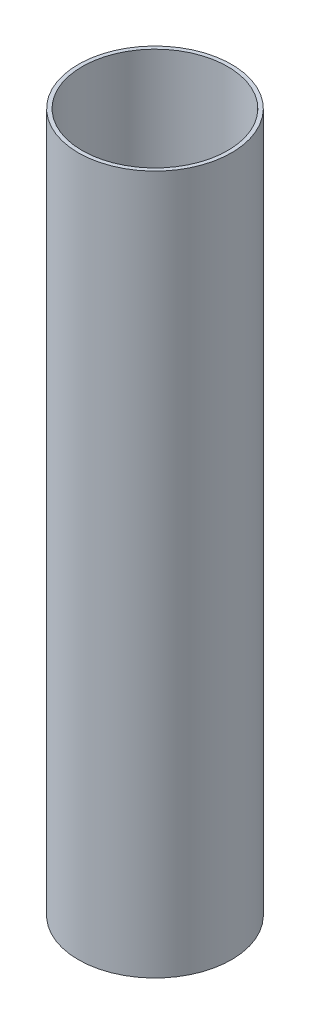
ISO-10303-21;
HEADER;
FILE_DESCRIPTION(('STEP AP214'),'2;1');
FILE_NAME('part.step','',(''),(''),'','','');
FILE_SCHEMA(('AUTOMOTIVE_DESIGN { 1 0 10303 214 1 1 1 1 }'));
ENDSEC;
DATA;
#1=APPLICATION_CONTEXT('core data for automotive mechanical design processes');
#2=APPLICATION_PROTOCOL_DEFINITION('international standard','automotive_design',2000,#1);
#3=PRODUCT_CONTEXT('',#1,'mechanical');
#4=PRODUCT('Part','Part','',(#3));
#5=PRODUCT_RELATED_PRODUCT_CATEGORY('part','',(#4));
#6=PRODUCT_DEFINITION_FORMATION('','',#4);
#7=PRODUCT_DEFINITION_CONTEXT('part definition',#1,'design');
#8=PRODUCT_DEFINITION('design','',#6,#7);
#9=PRODUCT_DEFINITION_SHAPE('','',#8);
#10=(LENGTH_UNIT() NAMED_UNIT(*) SI_UNIT(.MILLI.,.METRE.));
#11=(NAMED_UNIT(*) PLANE_ANGLE_UNIT() SI_UNIT($,.RADIAN.));
#12=(NAMED_UNIT(*) SI_UNIT($,.STERADIAN.) SOLID_ANGLE_UNIT());
#13=UNCERTAINTY_MEASURE_WITH_UNIT(LENGTH_MEASURE(1.E-05),#10,'distance_accuracy_value','');
#14=(GEOMETRIC_REPRESENTATION_CONTEXT(3) GLOBAL_UNCERTAINTY_ASSIGNED_CONTEXT((#13)) GLOBAL_UNIT_ASSIGNED_CONTEXT((#10,
#11,#12)) REPRESENTATION_CONTEXT('',''));
#15=CARTESIAN_POINT('',(0.,0.,0.));
#16=DIRECTION('',(0.,0.,1.));
#17=DIRECTION('',(1.,0.,0.));
#18=AXIS2_PLACEMENT_3D('',#15,#16,#17);
#19=CARTESIAN_POINT('',(0.,150.,0.));
#20=DIRECTION('',(0.,1.,0.));
#21=DIRECTION('',(0.,0.,1.));
#22=AXIS2_PLACEMENT_3D('',#19,#20,#21);
#23=PLANE('',#22);
#24=CARTESIAN_POINT('',(0.,150.,0.));
#25=DIRECTION('',(0.,1.,0.));
#26=DIRECTION('',(0.,0.,1.));
#27=AXIS2_PLACEMENT_3D('',#24,#25,#26);
#28=CIRCLE('',#27,32.9);
#29=CARTESIAN_POINT('',(0.,150.,32.9));
#30=VERTEX_POINT('',#29);
#31=EDGE_CURVE('E10',#30,#30,#28,.T.);
#32=ORIENTED_EDGE('',*,*,#31,.T.);
#33=EDGE_LOOP('',(#32));
#34=FACE_BOUND('',#33,.T.);
#35=CARTESIAN_POINT('',(0.,150.,0.));
#36=DIRECTION('',(0.,1.,0.));
#37=DIRECTION('',(0.,0.,1.));
#38=AXIS2_PLACEMENT_3D('',#35,#36,#37);
#39=CIRCLE('',#38,31.25);
#40=CARTESIAN_POINT('',(0.,150.,31.25));
#41=VERTEX_POINT('',#40);
#42=EDGE_CURVE('E42',#41,#41,#39,.T.);
#43=ORIENTED_EDGE('',*,*,#42,.F.);
#44=EDGE_LOOP('',(#43));
#45=FACE_BOUND('',#44,.T.);
#46=ADVANCED_FACE('F31',(#34,#45),#23,.T.);
#47=CARTESIAN_POINT('',(0.,-150.,0.));
#48=DIRECTION('',(0.,1.,0.));
#49=DIRECTION('',(0.,0.,1.));
#50=AXIS2_PLACEMENT_3D('',#47,#48,#49);
#51=PLANE('',#50);
#52=CARTESIAN_POINT('',(0.,-150.,0.));
#53=DIRECTION('',(0.,1.,0.));
#54=DIRECTION('',(0.,0.,1.));
#55=AXIS2_PLACEMENT_3D('',#52,#53,#54);
#56=CIRCLE('',#55,32.9);
#57=CARTESIAN_POINT('',(0.,-150.,32.9));
#58=VERTEX_POINT('',#57);
#59=EDGE_CURVE('E35',#58,#58,#56,.T.);
#60=ORIENTED_EDGE('',*,*,#59,.F.);
#61=EDGE_LOOP('',(#60));
#62=FACE_BOUND('',#61,.T.);
#63=CARTESIAN_POINT('',(0.,-150.,0.));
#64=DIRECTION('',(0.,1.,0.));
#65=DIRECTION('',(0.,0.,1.));
#66=AXIS2_PLACEMENT_3D('',#63,#64,#65);
#67=CIRCLE('',#66,31.25);
#68=CARTESIAN_POINT('',(0.,-150.,31.25));
#69=VERTEX_POINT('',#68);
#70=EDGE_CURVE('E44',#69,#69,#67,.T.);
#71=ORIENTED_EDGE('',*,*,#70,.T.);
#72=EDGE_LOOP('',(#71));
#73=FACE_BOUND('',#72,.T.);
#74=ADVANCED_FACE('F54',(#62,#73),#51,.F.);
#75=CARTESIAN_POINT('',(0.,150.,0.));
#76=DIRECTION('',(0.,-1.,0.));
#77=DIRECTION('',(0.,0.,-1.));
#78=AXIS2_PLACEMENT_3D('',#75,#76,#77);
#79=CYLINDRICAL_SURFACE('',#78,32.9);
#80=ORIENTED_EDGE('',*,*,#31,.F.);
#81=EDGE_LOOP('',(#80));
#82=FACE_BOUND('',#81,.T.);
#83=ORIENTED_EDGE('',*,*,#59,.T.);
#84=EDGE_LOOP('',(#83));
#85=FACE_BOUND('',#84,.T.);
#86=ADVANCED_FACE('F33',(#82,#85),#79,.T.);
#87=CARTESIAN_POINT('',(0.,150.,0.));
#88=DIRECTION('',(0.,-1.,0.));
#89=DIRECTION('',(0.,0.,-1.));
#90=AXIS2_PLACEMENT_3D('',#87,#88,#89);
#91=CYLINDRICAL_SURFACE('',#90,31.25);
#92=ORIENTED_EDGE('',*,*,#42,.T.);
#93=EDGE_LOOP('',(#92));
#94=FACE_BOUND('',#93,.T.);
#95=ORIENTED_EDGE('',*,*,#70,.F.);
#96=EDGE_LOOP('',(#95));
#97=FACE_BOUND('',#96,.T.);
#98=ADVANCED_FACE('F50',(#94,#97),#91,.F.);
#99=CLOSED_SHELL('',(#46,#74,#86,#98));
#100=MANIFOLD_SOLID_BREP('B2',#99);
#101=ADVANCED_BREP_SHAPE_REPRESENTATION('',(#18,#100),#14);
#102=SHAPE_DEFINITION_REPRESENTATION(#9,#101);
ENDSEC;
END-ISO-10303-21;
